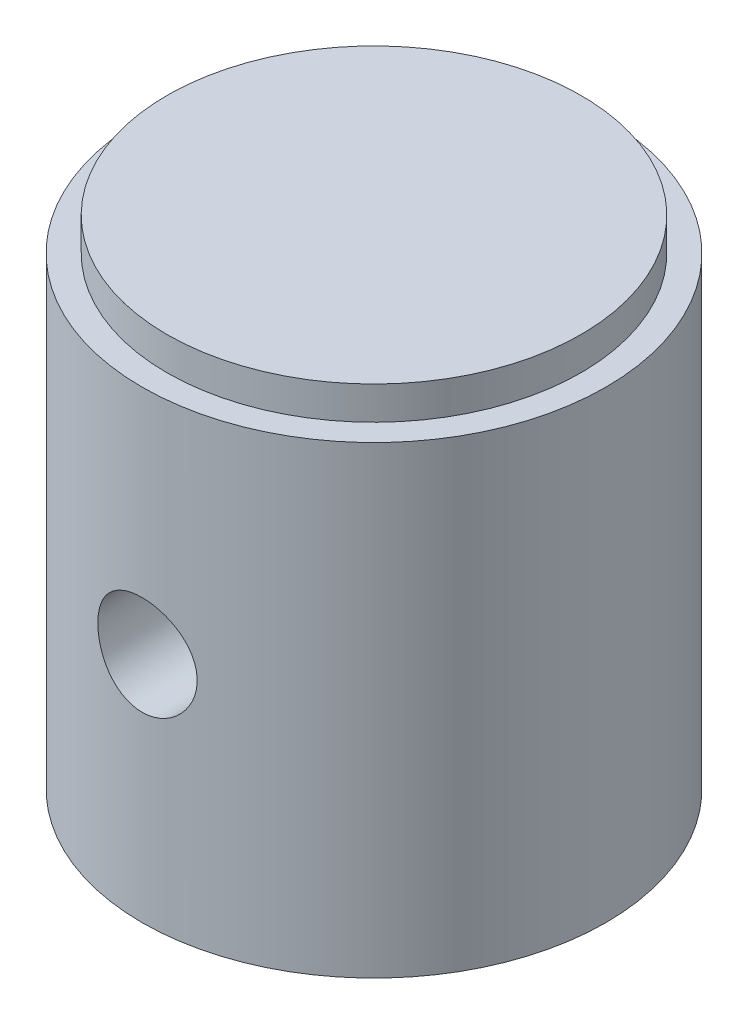
ISO-10303-21;
HEADER;
FILE_DESCRIPTION(('STEP AP214'),'2;1');
FILE_NAME('part.step','',(''),(''),'','','');
FILE_SCHEMA(('AUTOMOTIVE_DESIGN { 1 0 10303 214 1 1 1 1 }'));
ENDSEC;
DATA;
#1=APPLICATION_CONTEXT('core data for automotive mechanical design processes');
#2=APPLICATION_PROTOCOL_DEFINITION('international standard','automotive_design',2000,#1);
#3=PRODUCT_CONTEXT('',#1,'mechanical');
#4=PRODUCT('Part','Part','',(#3));
#5=PRODUCT_RELATED_PRODUCT_CATEGORY('part','',(#4));
#6=PRODUCT_DEFINITION_FORMATION('','',#4);
#7=PRODUCT_DEFINITION_CONTEXT('part definition',#1,'design');
#8=PRODUCT_DEFINITION('design','',#6,#7);
#9=PRODUCT_DEFINITION_SHAPE('','',#8);
#10=(LENGTH_UNIT() NAMED_UNIT(*) SI_UNIT(.MILLI.,.METRE.));
#11=(NAMED_UNIT(*) PLANE_ANGLE_UNIT() SI_UNIT($,.RADIAN.));
#12=(NAMED_UNIT(*) SI_UNIT($,.STERADIAN.) SOLID_ANGLE_UNIT());
#13=UNCERTAINTY_MEASURE_WITH_UNIT(LENGTH_MEASURE(1.E-05),#10,'distance_accuracy_value','');
#14=(GEOMETRIC_REPRESENTATION_CONTEXT(3) GLOBAL_UNCERTAINTY_ASSIGNED_CONTEXT((#13)) GLOBAL_UNIT_ASSIGNED_CONTEXT((#10,
#11,#12)) REPRESENTATION_CONTEXT('',''));
#15=CARTESIAN_POINT('',(0.,0.,0.));
#16=DIRECTION('',(0.,0.,1.));
#17=DIRECTION('',(1.,0.,0.));
#18=AXIS2_PLACEMENT_3D('',#15,#16,#17);
#19=CARTESIAN_POINT('',(-7.,-7.,0.));
#20=DIRECTION('',(0.,-1.,0.));
#21=DIRECTION('',(0.,0.,-1.));
#22=AXIS2_PLACEMENT_3D('',#19,#20,#21);
#23=PLANE('',#22);
#24=CARTESIAN_POINT('',(0.,-7.,0.));
#25=DIRECTION('',(0.,1.,0.));
#26=DIRECTION('',(0.,0.,1.));
#27=AXIS2_PLACEMENT_3D('',#24,#25,#26);
#28=CIRCLE('',#27,6.2);
#29=CARTESIAN_POINT('',(0.,-7.,6.2));
#30=VERTEX_POINT('',#29);
#31=EDGE_CURVE('E71',#30,#30,#28,.T.);
#32=ORIENTED_EDGE('',*,*,#31,.T.);
#33=EDGE_LOOP('',(#32));
#34=FACE_BOUND('',#33,.T.);
#35=CARTESIAN_POINT('',(0.,-7.,0.));
#36=DIRECTION('',(0.,1.,0.));
#37=DIRECTION('',(0.,0.,1.));
#38=AXIS2_PLACEMENT_3D('',#35,#36,#37);
#39=CIRCLE('',#38,7.);
#40=CARTESIAN_POINT('',(0.,-7.,7.));
#41=VERTEX_POINT('',#40);
#42=EDGE_CURVE('E128',#41,#41,#39,.T.);
#43=ORIENTED_EDGE('',*,*,#42,.F.);
#44=EDGE_LOOP('',(#43));
#45=FACE_BOUND('',#44,.T.);
#46=ADVANCED_FACE('F39',(#34,#45),#23,.T.);
#47=CARTESIAN_POINT('',(0.,-7.,0.));
#48=DIRECTION('',(0.,-1.,0.));
#49=DIRECTION('',(0.,0.,-1.));
#50=AXIS2_PLACEMENT_3D('',#47,#48,#49);
#51=CONICAL_SURFACE('',#50,6.2,0.34906585039886);
#52=CARTESIAN_POINT('',(0.,-3.01615774179072,0.));
#53=DIRECTION('',(0.,1.,0.));
#54=DIRECTION('',(0.,0.,1.));
#55=AXIS2_PLACEMENT_3D('',#52,#53,#54);
#56=CIRCLE('',#55,4.75);
#57=CARTESIAN_POINT('',(0.,-3.01615774179072,4.75));
#58=VERTEX_POINT('',#57);
#59=EDGE_CURVE('E65',#58,#58,#56,.T.);
#60=ORIENTED_EDGE('',*,*,#59,.T.);
#61=EDGE_LOOP('',(#60));
#62=FACE_BOUND('',#61,.T.);
#63=ORIENTED_EDGE('',*,*,#31,.F.);
#64=EDGE_LOOP('',(#63));
#65=FACE_BOUND('',#64,.T.);
#66=ADVANCED_FACE('F112',(#62,#65),#51,.F.);
#67=CARTESIAN_POINT('',(0.,19.6875,0.));
#68=DIRECTION('',(0.,1.,0.));
#69=DIRECTION('',(0.,0.,1.));
#70=AXIS2_PLACEMENT_3D('',#67,#68,#69);
#71=CYLINDRICAL_SURFACE('',#70,4.75);
#72=CARTESIAN_POINT('',(0.,-1.5,4.75));
#73=CARTESIAN_POINT('',(-0.0820835447314043,-1.4999995960029,4.74999967904614));
#74=CARTESIAN_POINT('',(-0.164171496501827,-1.49324013050539,4.74785228936723));
#75=CARTESIAN_POINT('',(-0.325944116631497,-1.46645355077682,4.73949648091444));
#76=CARTESIAN_POINT('',(-0.405628283459122,-1.44642368752273,4.73328722070904));
#77=CARTESIAN_POINT('',(-0.560237269504345,-1.39384104381599,4.71748543187023));
#78=CARTESIAN_POINT('',(-0.635169334090951,-1.36130788889304,4.7078982073406));
#79=CARTESIAN_POINT('',(-0.778514579207215,-1.28472646357131,4.68632862599565));
#80=CARTESIAN_POINT('',(-0.846926688392995,-1.24067630516156,4.67434587655187));
#81=CARTESIAN_POINT('',(-0.977443078754499,-1.14085266257357,4.64883376662147));
#82=CARTESIAN_POINT('',(-1.03931346588882,-1.08478215126322,4.63527018347254));
#83=CARTESIAN_POINT('',(-1.15294742613926,-0.963141719877229,4.60832176901776));
#84=CARTESIAN_POINT('',(-1.2047090669501,-0.897569987790586,4.5949369723419));
#85=CARTESIAN_POINT('',(-1.29793466853577,-0.75675121788412,4.56949296853185));
#86=CARTESIAN_POINT('',(-1.33910462019172,-0.681301196555854,4.55747591989588));
#87=CARTESIAN_POINT('',(-1.40807389327236,-0.524107538223757,4.53664362085522));
#88=CARTESIAN_POINT('',(-1.43587682167781,-0.442365605954656,4.52782750686213));
#89=CARTESIAN_POINT('',(-1.47646364106285,-0.277551097630556,4.51475360613692));
#90=CARTESIAN_POINT('',(-1.48968210274354,-0.194596265591199,4.51036428133252));
#91=CARTESIAN_POINT('',(-1.50208257395981,-0.0275391017801456,4.50625061102434));
#92=CARTESIAN_POINT('',(-1.50126840605207,0.0565629112565528,4.50652499510325));
#93=CARTESIAN_POINT('',(-1.48596623804714,0.219915518838902,4.51159176137022));
#94=CARTESIAN_POINT('',(-1.47203288124122,0.299224716240832,4.5162008739663));
#95=CARTESIAN_POINT('',(-1.43178798005592,0.454316527442601,4.52911970742075));
#96=CARTESIAN_POINT('',(-1.40547509472982,0.530098758225031,4.53742982916608));
#97=CARTESIAN_POINT('',(-1.34083084084602,0.677297267875655,4.55695325959034));
#98=CARTESIAN_POINT('',(-1.30232683858134,0.748632023154816,4.56820783899944));
#99=CARTESIAN_POINT('',(-1.21451321691615,0.884008824349574,4.59233341866295));
#100=CARTESIAN_POINT('',(-1.16520074091948,0.94804893553449,4.60520484585311));
#101=CARTESIAN_POINT('',(-1.05445721763047,1.0701513614985,4.63184688202886));
#102=CARTESIAN_POINT('',(-0.992568961591256,1.12779672907412,4.64563145900086));
#103=CARTESIAN_POINT('',(-0.859832533931192,1.2319932402701,4.67201892608795));
#104=CARTESIAN_POINT('',(-0.78898367078958,1.27854352684441,4.68462172487032));
#105=CARTESIAN_POINT('',(-0.639521244304239,1.35951904447478,4.70736283385871));
#106=CARTESIAN_POINT('',(-0.56084940322956,1.3938429460244,4.71748034190942));
#107=CARTESIAN_POINT('',(-0.398454273025006,1.44864477780197,4.73396063106369));
#108=CARTESIAN_POINT('',(-0.314732560358458,1.46912700498973,4.74032457733139));
#109=CARTESIAN_POINT('',(-0.148151942001063,1.49494945913915,4.74839235389519));
#110=CARTESIAN_POINT('',(-0.0653887879529904,1.50085396580235,4.75026975398177));
#111=CARTESIAN_POINT('',(0.0999556894804203,1.49894688258364,4.74966735792892));
#112=CARTESIAN_POINT('',(0.182537038204382,1.49113734353798,4.74718821327919));
#113=CARTESIAN_POINT('',(0.342984606452105,1.46247591011593,4.73826543461407));
#114=CARTESIAN_POINT('',(0.420917353280695,1.44196140872058,4.73192442641254));
#115=CARTESIAN_POINT('',(0.572211571751272,1.38888562686362,4.71602217273612));
#116=CARTESIAN_POINT('',(0.645572474036247,1.35632284945278,4.70646052712338));
#117=CARTESIAN_POINT('',(0.787656381223485,1.2791769099363,4.68480447515659));
#118=CARTESIAN_POINT('',(0.85622009899537,1.23431674292693,4.67265334948307));
#119=CARTESIAN_POINT('',(0.98503489825459,1.13418067887393,4.64720609363859));
#120=CARTESIAN_POINT('',(1.04528367215737,1.07890190045923,4.63390964727141));
#121=CARTESIAN_POINT('',(1.15829337789972,0.956843403257348,4.60699149316922));
#122=CARTESIAN_POINT('',(1.21065200367447,0.889688439428548,4.593378435549));
#123=CARTESIAN_POINT('',(1.3033950666371,0.747249961456588,4.5679297313532));
#124=CARTESIAN_POINT('',(1.34377965554056,0.671966550320408,4.55609406225838));
#125=CARTESIAN_POINT('',(1.41118548758715,0.515538051119366,4.53566962908159));
#126=CARTESIAN_POINT('',(1.43825519702983,0.434415473075744,4.52706911631109));
#127=CARTESIAN_POINT('',(1.47824972090378,0.268435199877372,4.5141696846939));
#128=CARTESIAN_POINT('',(1.49118006577835,0.183578978611892,4.50986908404445));
#129=CARTESIAN_POINT('',(1.50212620605735,0.0167530740697954,4.50623416787646));
#130=CARTESIAN_POINT('',(1.50080314084641,-0.0651689599984478,4.50667969384457));
#131=CARTESIAN_POINT('',(1.48488083195079,-0.227561657886265,4.51195053556041));
#132=CARTESIAN_POINT('',(1.47028223238921,-0.308032391929095,4.51677563881295));
#133=CARTESIAN_POINT('',(1.42866989928935,-0.464028470782518,4.53010652438159));
#134=CARTESIAN_POINT('',(1.40184917312304,-0.539610572788347,4.53855497041869));
#135=CARTESIAN_POINT('',(1.33670650315647,-0.685261995788799,4.55816492249634));
#136=CARTESIAN_POINT('',(1.29838218467217,-0.755330174772464,4.56932698861838));
#137=CARTESIAN_POINT('',(1.2095354013046,-0.890986745297526,4.59366117792159));
#138=CARTESIAN_POINT('',(1.15858784628932,-0.956285508268395,4.60689565835744));
#139=CARTESIAN_POINT('',(1.0466842406539,-1.07762083763069,4.63360081206468));
#140=CARTESIAN_POINT('',(0.985725490335815,-1.13365489742713,4.64707154816902));
#141=CARTESIAN_POINT('',(0.853066326423951,-1.23675692430509,4.67327443028953));
#142=CARTESIAN_POINT('',(0.781073823515226,-1.28346039072967,4.68596655437371));
#143=CARTESIAN_POINT('',(0.629859472842861,-1.36404168437099,4.70867379243004));
#144=CARTESIAN_POINT('',(0.550640331972045,-1.39792428963458,4.71868990328235));
#145=CARTESIAN_POINT('',(0.393635914977816,-1.44959876910323,4.7342664308075));
#146=CARTESIAN_POINT('',(0.316225133186438,-1.46844387958559,4.74011460510933));
#147=CARTESIAN_POINT('',(0.159210635950566,-1.49364336266444,4.7479811380776));
#148=CARTESIAN_POINT('',(0.0796073905560849,-1.50000039181002,4.75000031127187));
#149=CARTESIAN_POINT('',(0.,-1.5,4.75));
#150=B_SPLINE_CURVE_WITH_KNOTS('',3,(#72,#73,#74,#75,#76,#77,#78,#79,#80,#81,#82,#83,#84,#85,
#86,#87,#88,#89,#90,#91,#92,#93,#94,#95,#96,#97,#98,#99,#100,#101,#102,#103,#104,#105,#106,#107,
#108,#109,#110,#111,#112,#113,#114,#115,#116,#117,#118,#119,#120,#121,#122,#123,#124,#125,#126,
#127,#128,#129,#130,#131,#132,#133,#134,#135,#136,#137,#138,#139,#140,#141,#142,#143,#144,#145,
#146,#147,#148,#149),.UNSPECIFIED.,.T.,.F.,(4,2,2,2,2,2,2,2,2,2,2,2,2,2,2,2,2,2,2,2,2,2,2,2,2,2,
2,2,2,2,2,2,2,2,2,2,2,2,4),(0.,0.24595797085269,0.491966908951221,0.737591271008996,
0.9832559241528,1.23588716608584,1.4885666517754,1.74764569043263,2.00665477945945,
2.25771831624514,2.50871346318116,2.74955211816805,2.99041686673246,3.23485763830865,
3.47936309176113,3.73524847406481,3.99115361598384,4.24913282924923,4.50703191953741,
4.75477968540459,5.00249040554177,5.24388939060298,5.48531837858215,5.73270991189647,
5.98016996447342,6.23765665880274,6.49514009053908,6.75167921313646,7.00811795759371,
7.25271509638718,7.49730036806766,7.73815036093371,7.97905010664366,8.22954585775128,
8.48010927077556,8.73909121554315,8.99797654827696,9.23656564494835,9.47510398183575),.UNSPECIFIED.);
#151=CARTESIAN_POINT('',(0.,-1.5,4.75));
#152=VERTEX_POINT('',#151);
#153=EDGE_CURVE('E105',#152,#152,#150,.T.);
#154=ORIENTED_EDGE('',*,*,#153,.F.);
#155=EDGE_LOOP('',(#154));
#156=FACE_BOUND('',#155,.T.);
#157=CARTESIAN_POINT('',(1.5,0.,-4.50693909432998));
#158=CARTESIAN_POINT('',(1.49999958004515,0.0819682826761411,-4.50693949515468));
#159=CARTESIAN_POINT('',(1.49325840231682,0.163940983724744,-4.50919970874085));
#160=CARTESIAN_POINT('',(1.46655104887094,0.325475009499449,-4.5179553253781));
#161=CARTESIAN_POINT('',(1.44658152131253,0.405035717722683,-4.52445180182027));
#162=CARTESIAN_POINT('',(1.39417508352591,0.559382202849531,-4.54087234787262));
#163=CARTESIAN_POINT('',(1.36176059537411,0.634176286811513,-4.55079024986066));
#164=CARTESIAN_POINT('',(1.28545946652237,0.77728605600465,-4.57292751994247));
#165=CARTESIAN_POINT('',(1.24157071835092,0.845600547987965,-4.58514731070763));
#166=CARTESIAN_POINT('',(1.14191784971278,0.976208671452058,-4.6109923380212));
#167=CARTESIAN_POINT('',(1.08582030493755,1.03824156373591,-4.62464992232587));
#168=CARTESIAN_POINT('',(0.964055421977067,1.15219435282351,-4.65155671093151));
#169=CARTESIAN_POINT('',(0.89838672023377,1.20411280620364,-4.66480585671777));
#170=CARTESIAN_POINT('',(0.757464836701734,1.29751850612538,-4.68977365915903));
#171=CARTESIAN_POINT('',(0.682025001056138,1.33873651170335,-4.70144979545653));
#172=CARTESIAN_POINT('',(0.524852067423557,1.40779725722458,-4.72157773016224));
#173=CARTESIAN_POINT('',(0.443120487221092,1.43564321130615,-4.73003030329318));
#174=CARTESIAN_POINT('',(0.278414775826808,1.47629673110112,-4.74252974850081));
#175=CARTESIAN_POINT('',(0.195560751143444,1.48955010145605,-4.74670693307633));
#176=CARTESIAN_POINT('',(0.028706728610297,1.50205550409757,-4.75064554540297));
#177=CARTESIAN_POINT('',(-0.0552929988694201,1.50131078451008,-4.75040799755163));
#178=CARTESIAN_POINT('',(-0.218913619351864,1.48613280044412,-4.74563427350171));
#179=CARTESIAN_POINT('',(-0.298584494979865,1.47218295028315,-4.74124990899214));
#180=CARTESIAN_POINT('',(-0.454390311754809,1.43178484234958,-4.72886249486103));
#181=CARTESIAN_POINT('',(-0.530525020335841,1.40533576380501,-4.72085920760149));
#182=CARTESIAN_POINT('',(-0.678203652675078,1.34038381811517,-4.7019310355991));
#183=CARTESIAN_POINT('',(-0.749679013295809,1.30173567232402,-4.69097118266662));
#184=CARTESIAN_POINT('',(-0.885279102378907,1.21359968541286,-4.66728249867119));
#185=CARTESIAN_POINT('',(-0.949401935733847,1.16410905917775,-4.65455321340063));
#186=CARTESIAN_POINT('',(-1.07135837440922,1.05321803376508,-4.62803989727125));
#187=CARTESIAN_POINT('',(-1.12880871974839,0.991400765947416,-4.61423403233704));
#188=CARTESIAN_POINT('',(-1.23264301054731,0.858881841020854,-4.58758892442481));
#189=CARTESIAN_POINT('',(-1.27902559442059,0.788179092427403,-4.57474980051078));
#190=CARTESIAN_POINT('',(-1.35986638692084,0.638793228168752,-4.55138024059369));
#191=CARTESIAN_POINT('',(-1.39417963639867,0.560026861383904,-4.54087839223384));
#192=CARTESIAN_POINT('',(-1.44893342452635,0.397421898284389,-4.5237069894911));
#193=CARTESIAN_POINT('',(-1.46937907304313,0.313585182683363,-4.5170360236621));
#194=CARTESIAN_POINT('',(-1.49507161979024,0.146897639676088,-4.5085959379324));
#195=CARTESIAN_POINT('',(-1.50090655288536,0.064146996321232,-4.50663729609298));
#196=CARTESIAN_POINT('',(-1.49886513965521,-0.101157715966481,-4.50731687465407));
#197=CARTESIAN_POINT('',(-1.49099096720734,-0.183711813987271,-4.50995436623754));
#198=CARTESIAN_POINT('',(-1.46228084598242,-0.343726687897469,-4.51934163323601));
#199=CARTESIAN_POINT('',(-1.4418371919129,-0.421265920666951,-4.5259668251803));
#200=CARTESIAN_POINT('',(-1.38903056686353,-0.57180393247881,-4.54245022183902));
#201=CARTESIAN_POINT('',(-1.35666562487664,-0.644801958366223,-4.55230896114271));
#202=CARTESIAN_POINT('',(-1.2798587413425,-0.78654170372151,-4.57450539166733));
#203=CARTESIAN_POINT('',(-1.2350921421442,-0.855097228273855,-4.58690698850856));
#204=CARTESIAN_POINT('',(-1.13512998682984,-0.98393704575857,-4.61266077618539));
#205=CARTESIAN_POINT('',(-1.07993166463934,-1.0442191375734,-4.62601321856053));
#206=CARTESIAN_POINT('',(-0.957886037531119,-1.15744177660799,-4.65285013455169));
#207=CARTESIAN_POINT('',(-0.890643665109767,-1.20996198288841,-4.66631614662306));
#208=CARTESIAN_POINT('',(-0.747973360630616,-1.30299130819133,-4.6912975579683));
#209=CARTESIAN_POINT('',(-0.672545793179843,-1.34350096192049,-4.70281304406929));
#210=CARTESIAN_POINT('',(-0.516099288450847,-1.41097236253163,-4.72253168708172));
#211=CARTESIAN_POINT('',(-0.435125281433142,-1.43803103178452,-4.73075845435932));
#212=CARTESIAN_POINT('',(-0.269469399491867,-1.478053044343,-4.7430763734001));
#213=CARTESIAN_POINT('',(-0.184788721002361,-1.49102090146525,-4.74716884950256));
#214=CARTESIAN_POINT('',(-0.017988648587824,-1.50212030326586,-4.7506674317259));
#215=CARTESIAN_POINT('',(0.0640868361538649,-1.50085840271502,-4.75026513795577));
#216=CARTESIAN_POINT('',(0.226803220963033,-1.48500545466395,-4.74528029002945));
#217=CARTESIAN_POINT('',(0.307444217580877,-1.47041530772828,-4.74069801830655));
#218=CARTESIAN_POINT('',(0.463969836764499,-1.42870894005712,-4.72793024704182));
#219=CARTESIAN_POINT('',(0.539902672774311,-1.4017580672524,-4.71979237633648));
#220=CARTESIAN_POINT('',(0.686204345183071,-1.33624514340539,-4.70075227796056));
#221=CARTESIAN_POINT('',(0.756572215112847,-1.29768108106414,-4.68984957149724));
#222=CARTESIAN_POINT('',(0.892382156713932,-1.20850268052653,-4.66594837362514));
#223=CARTESIAN_POINT('',(0.957571386267191,-1.15751932859434,-4.65289067194133));
#224=CARTESIAN_POINT('',(1.07867009763973,-1.04559678750154,-4.62631837968684));
#225=CARTESIAN_POINT('',(1.13457676425287,-0.984654589110596,-4.61280365200012));
#226=CARTESIAN_POINT('',(1.23744612372159,-0.852058557227864,-4.58630016066439));
#227=CARTESIAN_POINT('',(1.28403955823579,-0.780110701741931,-4.5733449634976));
#228=CARTESIAN_POINT('',(1.36442560849337,-0.629013943279334,-4.55001145096036));
#229=CARTESIAN_POINT('',(1.39822313048984,-0.549867814754984,-4.5396321484584));
#230=CARTESIAN_POINT('',(1.44974900503547,-0.39305354742876,-4.52342799882925));
#231=CARTESIAN_POINT('',(1.46853682069789,-0.315763554142098,-4.51730787458817));
#232=CARTESIAN_POINT('',(1.49366090326981,-0.158983374147427,-4.50906374742014));
#233=CARTESIAN_POINT('',(1.50000040727695,-0.0794937648882832,-4.50693870560567));
#234=CARTESIAN_POINT('',(1.5,0.,-4.50693909432998));
#235=B_SPLINE_CURVE_WITH_KNOTS('',3,(#157,#158,#159,#160,#161,#162,#163,#164,#165,#166,#167,
#168,#169,#170,#171,#172,#173,#174,#175,#176,#177,#178,#179,#180,#181,#182,#183,#184,#185,#186,
#187,#188,#189,#190,#191,#192,#193,#194,#195,#196,#197,#198,#199,#200,#201,#202,#203,#204,#205,
#206,#207,#208,#209,#210,#211,#212,#213,#214,#215,#216,#217,#218,#219,#220,#221,#222,#223,#224,
#225,#226,#227,#228,#229,#230,#231,#232,#233,#234),.UNSPECIFIED.,.T.,.F.,(4,2,2,2,2,2,2,2,2,2,2,
2,2,2,2,2,2,2,2,2,2,2,2,2,2,2,2,2,2,2,2,2,2,2,2,2,2,2,4),(0.,0.245611090579273,
0.491284438685784,0.736517218845768,0.981795072467575,1.23487733964253,1.48799569757339,
1.74697244897189,2.00588692090239,2.25665093580603,2.50735676398231,2.74922580012767,
2.99111072100683,3.2359924360223,3.48093712787276,3.7362950135404,3.99168429786021,
4.25004385973256,4.50830817072249,4.75599786818586,5.00364829262799,5.24393641423545,
5.48426428174336,5.73160040316639,5.97900220045884,6.23690747266809,6.49480126127746,
6.75080881416402,7.0067343340116,7.25179355317672,7.49683621537552,7.73869250201122,
7.9805907000726,8.2308132702795,8.48111158966217,8.739930558781,8.99865018989115,
9.23690856092584,9.47510496630383),.UNSPECIFIED.);
#236=CARTESIAN_POINT('',(1.5,0.,-4.50693909432998));
#237=VERTEX_POINT('',#236);
#238=EDGE_CURVE('E98',#237,#237,#235,.T.);
#239=ORIENTED_EDGE('',*,*,#238,.F.);
#240=EDGE_LOOP('',(#239));
#241=FACE_BOUND('',#240,.T.);
#242=CARTESIAN_POINT('',(0.,4.,0.));
#243=DIRECTION('',(0.,1.,0.));
#244=DIRECTION('',(0.,0.,1.));
#245=AXIS2_PLACEMENT_3D('',#242,#243,#244);
#246=CIRCLE('',#245,4.75);
#247=CARTESIAN_POINT('',(0.,4.,4.75));
#248=VERTEX_POINT('',#247);
#249=EDGE_CURVE('E62',#248,#248,#246,.T.);
#250=ORIENTED_EDGE('',*,*,#249,.T.);
#251=EDGE_LOOP('',(#250));
#252=FACE_BOUND('',#251,.T.);
#253=ORIENTED_EDGE('',*,*,#59,.F.);
#254=EDGE_LOOP('',(#253));
#255=FACE_BOUND('',#254,.T.);
#256=ADVANCED_FACE('F58',(#156,#241,#252,#255),#71,.F.);
#257=CARTESIAN_POINT('',(0.,4.,0.));
#258=DIRECTION('',(0.,-1.,0.));
#259=DIRECTION('',(0.,0.,-1.));
#260=AXIS2_PLACEMENT_3D('',#257,#258,#259);
#261=CONICAL_SURFACE('',#260,4.75,1.02974425867665);
#262=CARTESIAN_POINT('',(0.,6.85408794038094,0.));
#263=VERTEX_POINT('',#262);
#264=VERTEX_LOOP('',#263);
#265=FACE_BOUND('',#264,.T.);
#266=ORIENTED_EDGE('',*,*,#249,.F.);
#267=EDGE_LOOP('',(#266));
#268=FACE_BOUND('',#267,.T.);
#269=ADVANCED_FACE('F54',(#265,#268),#261,.F.);
#270=CARTESIAN_POINT('',(0.,8.,0.));
#271=DIRECTION('',(0.,1.,0.));
#272=DIRECTION('',(0.,0.,1.));
#273=AXIS2_PLACEMENT_3D('',#270,#271,#272);
#274=PLANE('',#273);
#275=CARTESIAN_POINT('',(0.,8.,0.));
#276=DIRECTION('',(0.,1.,0.));
#277=DIRECTION('',(0.,0.,1.));
#278=AXIS2_PLACEMENT_3D('',#275,#276,#277);
#279=CIRCLE('',#278,6.25);
#280=CARTESIAN_POINT('',(0.,8.,6.25));
#281=VERTEX_POINT('',#280);
#282=EDGE_CURVE('E66',#281,#281,#279,.T.);
#283=ORIENTED_EDGE('',*,*,#282,.T.);
#284=EDGE_LOOP('',(#283));
#285=FACE_BOUND('',#284,.T.);
#286=ADVANCED_FACE('F57',(#285),#274,.T.);
#287=CARTESIAN_POINT('',(0.,19.6875,0.));
#288=DIRECTION('',(0.,1.,0.));
#289=DIRECTION('',(0.,0.,1.));
#290=AXIS2_PLACEMENT_3D('',#287,#288,#289);
#291=CYLINDRICAL_SURFACE('',#290,6.25);
#292=CARTESIAN_POINT('',(0.,7.,0.));
#293=DIRECTION('',(0.,1.,0.));
#294=DIRECTION('',(0.,0.,1.));
#295=AXIS2_PLACEMENT_3D('',#292,#293,#294);
#296=CIRCLE('',#295,6.25);
#297=CARTESIAN_POINT('',(0.,7.,6.25));
#298=VERTEX_POINT('',#297);
#299=EDGE_CURVE('E74',#298,#298,#296,.T.);
#300=ORIENTED_EDGE('',*,*,#299,.T.);
#301=EDGE_LOOP('',(#300));
#302=FACE_BOUND('',#301,.T.);
#303=ORIENTED_EDGE('',*,*,#282,.F.);
#304=EDGE_LOOP('',(#303));
#305=FACE_BOUND('',#304,.T.);
#306=ADVANCED_FACE('F141',(#302,#305),#291,.T.);
#307=CARTESIAN_POINT('',(-6.25,7.,0.));
#308=DIRECTION('',(0.,1.,0.));
#309=DIRECTION('',(0.,0.,1.));
#310=AXIS2_PLACEMENT_3D('',#307,#308,#309);
#311=PLANE('',#310);
#312=CARTESIAN_POINT('',(0.,7.,0.));
#313=DIRECTION('',(0.,1.,0.));
#314=DIRECTION('',(0.,0.,1.));
#315=AXIS2_PLACEMENT_3D('',#312,#313,#314);
#316=CIRCLE('',#315,7.);
#317=CARTESIAN_POINT('',(0.,7.,7.));
#318=VERTEX_POINT('',#317);
#319=EDGE_CURVE('E131',#318,#318,#316,.T.);
#320=ORIENTED_EDGE('',*,*,#319,.T.);
#321=EDGE_LOOP('',(#320));
#322=FACE_BOUND('',#321,.T.);
#323=ORIENTED_EDGE('',*,*,#299,.F.);
#324=EDGE_LOOP('',(#323));
#325=FACE_BOUND('',#324,.T.);
#326=ADVANCED_FACE('F144',(#322,#325),#311,.T.);
#327=CARTESIAN_POINT('',(0.,19.6875,0.));
#328=DIRECTION('',(0.,1.,0.));
#329=DIRECTION('',(0.,0.,1.));
#330=AXIS2_PLACEMENT_3D('',#327,#328,#329);
#331=CYLINDRICAL_SURFACE('',#330,7.);
#332=CARTESIAN_POINT('',(0.,1.5,-7.));
#333=CARTESIAN_POINT('',(0.0832358860906166,1.4999971004257,-6.99999846043226));
#334=CARTESIAN_POINT('',(0.166507195600275,1.49304839161214,-6.9985002594971));
#335=CARTESIAN_POINT('',(0.330687344293327,1.46546434314641,-6.99266829827727));
#336=CARTESIAN_POINT('',(0.41159440357119,1.44481895580507,-6.98833245637099));
#337=CARTESIAN_POINT('',(0.568649323817737,1.39051563539196,-6.97730831788826));
#338=CARTESIAN_POINT('',(0.644801963446556,1.35687102061868,-6.97062242967171));
#339=CARTESIAN_POINT('',(0.790378177960787,1.27756591382874,-6.9556210681797));
#340=CARTESIAN_POINT('',(0.859801981747369,1.23190583075006,-6.9473056503666));
#341=CARTESIAN_POINT('',(0.991024790535229,1.12911970032649,-6.9298136924631));
#342=CARTESIAN_POINT('',(1.05270503419445,1.07184377810147,-6.92062683143259));
#343=CARTESIAN_POINT('',(1.16566042389435,0.947773684314803,-6.90250069814144));
#344=CARTESIAN_POINT('',(1.21693467150908,0.880978691748742,-6.8935614473163));
#345=CARTESIAN_POINT('',(1.30814204379809,0.738894247139567,-6.87684116047225));
#346=CARTESIAN_POINT('',(1.34794958335009,0.66352248224379,-6.8690733634436));
#347=CARTESIAN_POINT('',(1.41428823691148,0.506965546233162,-6.85572325558537));
#348=CARTESIAN_POINT('',(1.44082087001716,0.425781041507426,-6.85014069470711));
#349=CARTESIAN_POINT('',(1.47946574422454,0.261188913411926,-6.8418980892631));
#350=CARTESIAN_POINT('',(1.49178779748342,0.177832724336135,-6.83919556896486));
#351=CARTESIAN_POINT('',(1.50231395206577,0.0101957674930048,-6.83689139845105));
#352=CARTESIAN_POINT('',(1.50051971664629,-0.0740848901799472,-6.83728938291729));
#353=CARTESIAN_POINT('',(1.48303326340861,-0.239624687933793,-6.84110276603832));
#354=CARTESIAN_POINT('',(1.46758398649408,-0.320910889100154,-6.84446541682162));
#355=CARTESIAN_POINT('',(1.42361054298677,-0.479710240289342,-6.85374593375788));
#356=CARTESIAN_POINT('',(1.39508566936466,-0.557223186032321,-6.85966393808402));
#357=CARTESIAN_POINT('',(1.32554551075991,-0.706962872873339,-6.87344080755724));
#358=CARTESIAN_POINT('',(1.2844361097283,-0.779144512712552,-6.88131420983365));
#359=CARTESIAN_POINT('',(1.19096007283993,-0.915675164957958,-6.89810572501288));
#360=CARTESIAN_POINT('',(1.13859196103562,-0.980023148686202,-6.90702397481896));
#361=CARTESIAN_POINT('',(1.0227954275532,-1.1004593556734,-6.92512718393878));
#362=CARTESIAN_POINT('',(0.95916023396441,-1.15634870658474,-6.93431383972178));
#363=CARTESIAN_POINT('',(0.823317306269096,-1.25669373368966,-6.95175017497059));
#364=CARTESIAN_POINT('',(0.7511094287754,-1.30114921860039,-6.95999983875972));
#365=CARTESIAN_POINT('',(0.599933462049959,-1.37741067990693,-6.97465778534003));
#366=CARTESIAN_POINT('',(0.520952258863483,-1.40919141257798,-6.98106238643354));
#367=CARTESIAN_POINT('',(0.358603146685707,-1.45897564832109,-6.99128109245334));
#368=CARTESIAN_POINT('',(0.275235851133669,-1.47698107256332,-6.99509555860383));
#369=CARTESIAN_POINT('',(0.108187670836629,-1.49841621414342,-6.99965306347808));
#370=CARTESIAN_POINT('',(0.0245431772716144,-1.50211771288178,-7.00045336521065));
#371=CARTESIAN_POINT('',(-0.142168973650405,-1.49557542887484,-6.99905248935969));
#372=CARTESIAN_POINT('',(-0.225236668127255,-1.48533255203706,-6.99685150675698));
#373=CARTESIAN_POINT('',(-0.387542537982806,-1.4514177563383,-6.98973143045266));
#374=CARTESIAN_POINT('',(-0.466811712908477,-1.42788763052747,-6.98484105045459));
#375=CARTESIAN_POINT('',(-0.620278450473418,-1.36822305700518,-6.9728892442151));
#376=CARTESIAN_POINT('',(-0.69447559258774,-1.33208756568835,-6.96582763822237));
#377=CARTESIAN_POINT('',(-0.836821397964754,-1.24766645693967,-6.950175043904));
#378=CARTESIAN_POINT('',(-0.90487257511114,-1.19922020509027,-6.94156431354275));
#379=CARTESIAN_POINT('',(-1.0319769255236,-1.09176517511126,-6.92381033034847));
#380=CARTESIAN_POINT('',(-1.091028978692,-1.03275508411256,-6.91466701142097));
#381=CARTESIAN_POINT('',(-1.19952711057989,-0.904602629812864,-6.89668172706324));
#382=CARTESIAN_POINT('',(-1.24878537255156,-0.835299900777897,-6.88784792221285));
#383=CARTESIAN_POINT('',(-1.3349641538604,-0.689245403522007,-6.87166654559681));
#384=CARTESIAN_POINT('',(-1.37188519913706,-0.612493953022508,-6.86431891048055));
#385=CARTESIAN_POINT('',(-1.43209741248548,-0.454127701005397,-6.8520100980739));
#386=CARTESIAN_POINT('',(-1.45546398641275,-0.372542643569332,-6.84703574582967));
#387=CARTESIAN_POINT('',(-1.48812696085335,-0.206484416166364,-6.84001186708418));
#388=CARTESIAN_POINT('',(-1.49742550780258,-0.12201168879868,-6.83796189439705));
#389=CARTESIAN_POINT('',(-1.5015999992604,0.045532343175243,-6.83704618848155));
#390=CARTESIAN_POINT('',(-1.49677347258311,0.128596014980579,-6.83811476518543));
#391=CARTESIAN_POINT('',(-1.47349789406331,0.292697242132587,-6.8431676318483));
#392=CARTESIAN_POINT('',(-1.45504898957979,0.373734819386573,-6.84715189026714));
#393=CARTESIAN_POINT('',(-1.40519345940434,0.531258657869168,-6.85755581104157));
#394=CARTESIAN_POINT('',(-1.37382847170887,0.607758648664291,-6.86396764224703));
#395=CARTESIAN_POINT('',(-1.29906751595601,0.75445537250685,-6.87850764590649));
#396=CARTESIAN_POINT('',(-1.255670353015,0.824651478615044,-6.88663598880363));
#397=CARTESIAN_POINT('',(-1.15708290349304,0.958218193725366,-6.90389055593232));
#398=CARTESIAN_POINT('',(-1.10167987421237,1.02142969594698,-6.91303309938926));
#399=CARTESIAN_POINT('',(-0.98108655461962,1.13775626252046,-6.93117449799694));
#400=CARTESIAN_POINT('',(-0.915894009385596,1.19086899431221,-6.94017331951296));
#401=CARTESIAN_POINT('',(-0.776603147268717,1.28611595950556,-6.95714491048987));
#402=CARTESIAN_POINT('',(-0.702404846009641,1.32810660623098,-6.96510364570626));
#403=CARTESIAN_POINT('',(-0.547850160940598,1.39895452890618,-6.97895826104018));
#404=CARTESIAN_POINT('',(-0.46749910586388,1.42782302258504,-6.98485590212342));
#405=CARTESIAN_POINT('',(-0.322535217553203,1.46635218513115,-6.99284848461771));
#406=CARTESIAN_POINT('',(-0.258717205545978,1.47894643398003,-6.99551391888263));
#407=CARTESIAN_POINT('',(-0.129939960853846,1.49577130171167,-6.99909024154719));
#408=CARTESIAN_POINT('',(-0.0649807750887446,1.50000226364606,-7.00000120191314));
#409=CARTESIAN_POINT('',(0.,1.5,-7.));
#410=B_SPLINE_CURVE_WITH_KNOTS('',3,(#332,#333,#334,#335,#336,#337,#338,#339,#340,#341,#342,
#343,#344,#345,#346,#347,#348,#349,#350,#351,#352,#353,#354,#355,#356,#357,#358,#359,#360,#361,
#362,#363,#364,#365,#366,#367,#368,#369,#370,#371,#372,#373,#374,#375,#376,#377,#378,#379,#380,
#381,#382,#383,#384,#385,#386,#387,#388,#389,#390,#391,#392,#393,#394,#395,#396,#397,#398,#399,
#400,#401,#402,#403,#404,#405,#406,#407,#408,#409),.UNSPECIFIED.,.T.,.F.,(4,2,2,2,2,2,2,2,2,2,2,
2,2,2,2,2,2,2,2,2,2,2,2,2,2,2,2,2,2,2,2,2,2,2,2,2,2,2,4),(0.,0.249469836512082,
0.499122883219936,0.748520824425602,0.997910278645886,1.25074961881732,1.50361077918506,
1.7591442921451,2.0146485567749,2.26633008124666,2.51798195169165,2.76524475452928,
3.01252092904568,3.26169356165968,3.51089887920889,3.76527011050291,4.0196455970235,
4.27452521139806,4.52936927256343,4.77934665704185,5.02930780231429,5.27665060589267,
5.52401389198434,5.77478733867803,6.02559197304485,6.28082063283534,6.53603841075806,
6.78982240408475,7.04356767229185,7.29200680540294,7.5404432510827,7.78808499706785,
8.03575134451623,8.28822950154114,8.54076590397115,8.79641910357222,9.05185334010271,
9.24661799132294,9.44137465337336),.UNSPECIFIED.);
#411=CARTESIAN_POINT('',(0.,1.5,-7.));
#412=VERTEX_POINT('',#411);
#413=EDGE_CURVE('E11',#412,#412,#410,.T.);
#414=ORIENTED_EDGE('',*,*,#413,.F.);
#415=EDGE_LOOP('',(#414));
#416=FACE_BOUND('',#415,.T.);
#417=CARTESIAN_POINT('',(0.,-1.5,7.));
#418=CARTESIAN_POINT('',(0.0832358860906165,-1.4999971004257,6.99999846043226));
#419=CARTESIAN_POINT('',(0.166507195600274,-1.49304839161215,6.9985002594971));
#420=CARTESIAN_POINT('',(0.330687344293327,-1.46546434314641,6.99266829827727));
#421=CARTESIAN_POINT('',(0.41159440357119,-1.44481895580507,6.98833245637099));
#422=CARTESIAN_POINT('',(0.568649323817737,-1.39051563539196,6.97730831788826));
#423=CARTESIAN_POINT('',(0.644801963446556,-1.35687102061868,6.97062242967171));
#424=CARTESIAN_POINT('',(0.790378177960788,-1.27756591382874,6.9556210681797));
#425=CARTESIAN_POINT('',(0.85980198174737,-1.23190583075006,6.9473056503666));
#426=CARTESIAN_POINT('',(0.99102479053523,-1.12911970032649,6.9298136924631));
#427=CARTESIAN_POINT('',(1.05270503419445,-1.07184377810147,6.92062683143259));
#428=CARTESIAN_POINT('',(1.16566042389435,-0.947773684314803,6.90250069814144));
#429=CARTESIAN_POINT('',(1.21693467150908,-0.880978691748742,6.8935614473163));
#430=CARTESIAN_POINT('',(1.30814204379809,-0.738894247139566,6.87684116047225));
#431=CARTESIAN_POINT('',(1.34794958335009,-0.66352248224379,6.8690733634436));
#432=CARTESIAN_POINT('',(1.41428823691148,-0.506965546233162,6.85572325558537));
#433=CARTESIAN_POINT('',(1.44082087001716,-0.425781041507426,6.85014069470711));
#434=CARTESIAN_POINT('',(1.47946574422454,-0.261188913411925,6.8418980892631));
#435=CARTESIAN_POINT('',(1.49178779748342,-0.177832724336134,6.83919556896486));
#436=CARTESIAN_POINT('',(1.50231395206577,-0.0101957674930048,6.83689139845105));
#437=CARTESIAN_POINT('',(1.50051971664629,0.0740848901799472,6.83728938291729));
#438=CARTESIAN_POINT('',(1.48303326340861,0.239624687933793,6.84110276603832));
#439=CARTESIAN_POINT('',(1.46758398649408,0.320910889100153,6.84446541682162));
#440=CARTESIAN_POINT('',(1.42361054298677,0.479710240289342,6.85374593375788));
#441=CARTESIAN_POINT('',(1.39508566936466,0.557223186032321,6.85966393808402));
#442=CARTESIAN_POINT('',(1.32554551075991,0.706962872873338,6.87344080755724));
#443=CARTESIAN_POINT('',(1.2844361097283,0.779144512712551,6.88131420983365));
#444=CARTESIAN_POINT('',(1.19096007283993,0.915675164957957,6.89810572501288));
#445=CARTESIAN_POINT('',(1.13859196103562,0.980023148686202,6.90702397481896));
#446=CARTESIAN_POINT('',(1.0227954275532,1.1004593556734,6.92512718393878));
#447=CARTESIAN_POINT('',(0.95916023396441,1.15634870658474,6.93431383972177));
#448=CARTESIAN_POINT('',(0.823317306269096,1.25669373368966,6.95175017497059));
#449=CARTESIAN_POINT('',(0.7511094287754,1.30114921860039,6.95999983875972));
#450=CARTESIAN_POINT('',(0.599933462049959,1.37741067990693,6.97465778534003));
#451=CARTESIAN_POINT('',(0.520952258863483,1.40919141257798,6.98106238643354));
#452=CARTESIAN_POINT('',(0.358603146685707,1.45897564832109,6.99128109245333));
#453=CARTESIAN_POINT('',(0.275235851133669,1.47698107256332,6.99509555860383));
#454=CARTESIAN_POINT('',(0.10818767083663,1.49841621414342,6.99965306347808));
#455=CARTESIAN_POINT('',(0.0245431772716154,1.50211771288178,7.00045336521065));
#456=CARTESIAN_POINT('',(-0.142168973650404,1.49557542887484,6.99905248935969));
#457=CARTESIAN_POINT('',(-0.225236668127255,1.48533255203706,6.99685150675698));
#458=CARTESIAN_POINT('',(-0.387542537982805,1.4514177563383,6.98973143045266));
#459=CARTESIAN_POINT('',(-0.466811712908477,1.42788763052747,6.98484105045459));
#460=CARTESIAN_POINT('',(-0.620278450473418,1.36822305700518,6.9728892442151));
#461=CARTESIAN_POINT('',(-0.69447559258774,1.33208756568835,6.96582763822237));
#462=CARTESIAN_POINT('',(-0.836821397964754,1.24766645693967,6.950175043904));
#463=CARTESIAN_POINT('',(-0.90487257511114,1.19922020509027,6.94156431354275));
#464=CARTESIAN_POINT('',(-1.0319769255236,1.09176517511126,6.92381033034847));
#465=CARTESIAN_POINT('',(-1.091028978692,1.03275508411256,6.91466701142097));
#466=CARTESIAN_POINT('',(-1.19952711057989,0.904602629812864,6.89668172706324));
#467=CARTESIAN_POINT('',(-1.24878537255157,0.835299900777897,6.88784792221285));
#468=CARTESIAN_POINT('',(-1.3349641538604,0.689245403522007,6.87166654559681));
#469=CARTESIAN_POINT('',(-1.37188519913706,0.612493953022508,6.86431891048055));
#470=CARTESIAN_POINT('',(-1.43209741248548,0.454127701005397,6.8520100980739));
#471=CARTESIAN_POINT('',(-1.45546398641275,0.372542643569332,6.84703574582967));
#472=CARTESIAN_POINT('',(-1.48812696085335,0.206484416166364,6.84001186708418));
#473=CARTESIAN_POINT('',(-1.49742550780258,0.12201168879868,6.83796189439705));
#474=CARTESIAN_POINT('',(-1.5015999992604,-0.0455323431752431,6.83704618848155));
#475=CARTESIAN_POINT('',(-1.49677347258311,-0.128596014980579,6.83811476518543));
#476=CARTESIAN_POINT('',(-1.47349789406331,-0.292697242132587,6.8431676318483));
#477=CARTESIAN_POINT('',(-1.45504898957979,-0.373734819386573,6.84715189026714));
#478=CARTESIAN_POINT('',(-1.40519345940434,-0.531258657869168,6.85755581104157));
#479=CARTESIAN_POINT('',(-1.37382847170887,-0.607758648664291,6.86396764224703));
#480=CARTESIAN_POINT('',(-1.29906751595601,-0.75445537250685,6.87850764590649));
#481=CARTESIAN_POINT('',(-1.255670353015,-0.824651478615044,6.88663598880362));
#482=CARTESIAN_POINT('',(-1.15708290349304,-0.958218193725365,6.90389055593232));
#483=CARTESIAN_POINT('',(-1.10167987421237,-1.02142969594698,6.91303309938926));
#484=CARTESIAN_POINT('',(-0.981086554619621,-1.13775626252046,6.93117449799694));
#485=CARTESIAN_POINT('',(-0.915894009385597,-1.1908689943122,6.94017331951296));
#486=CARTESIAN_POINT('',(-0.776603147268718,-1.28611595950556,6.95714491048987));
#487=CARTESIAN_POINT('',(-0.702404846009642,-1.32810660623098,6.96510364570626));
#488=CARTESIAN_POINT('',(-0.547850160940599,-1.39895452890618,6.97895826104018));
#489=CARTESIAN_POINT('',(-0.467499105863881,-1.42782302258504,6.98485590212342));
#490=CARTESIAN_POINT('',(-0.322535217553204,-1.46635218513115,6.99284848461771));
#491=CARTESIAN_POINT('',(-0.258717205545979,-1.47894643398003,6.99551391888263));
#492=CARTESIAN_POINT('',(-0.129939960853846,-1.49577130171167,6.99909024154719));
#493=CARTESIAN_POINT('',(-0.064980775088745,-1.50000226364606,7.00000120191314));
#494=CARTESIAN_POINT('',(0.,-1.5,7.));
#495=B_SPLINE_CURVE_WITH_KNOTS('',3,(#417,#418,#419,#420,#421,#422,#423,#424,#425,#426,#427,
#428,#429,#430,#431,#432,#433,#434,#435,#436,#437,#438,#439,#440,#441,#442,#443,#444,#445,#446,
#447,#448,#449,#450,#451,#452,#453,#454,#455,#456,#457,#458,#459,#460,#461,#462,#463,#464,#465,
#466,#467,#468,#469,#470,#471,#472,#473,#474,#475,#476,#477,#478,#479,#480,#481,#482,#483,#484,
#485,#486,#487,#488,#489,#490,#491,#492,#493,#494),.UNSPECIFIED.,.T.,.F.,(4,2,2,2,2,2,2,2,2,2,2,
2,2,2,2,2,2,2,2,2,2,2,2,2,2,2,2,2,2,2,2,2,2,2,2,2,2,2,4),(0.,0.249469836512082,
0.499122883219936,0.748520824425603,0.997910278645887,1.25074961881732,1.50361077918506,
1.7591442921451,2.0146485567749,2.26633008124666,2.51798195169165,2.76524475452928,
3.01252092904568,3.26169356165968,3.51089887920889,3.76527011050291,4.0196455970235,
4.27452521139806,4.52936927256343,4.77934665704185,5.02930780231429,5.27665060589267,
5.52401389198434,5.77478733867803,6.02559197304485,6.28082063283534,6.53603841075806,
6.78982240408475,7.04356767229185,7.29200680540294,7.5404432510827,7.78808499706785,
8.03575134451623,8.28822950154114,8.54076590397115,8.79641910357222,9.05185334010271,
9.24661799132294,9.44137465337336),.UNSPECIFIED.);
#496=CARTESIAN_POINT('',(0.,-1.5,7.));
#497=VERTEX_POINT('',#496);
#498=EDGE_CURVE('E51',#497,#497,#495,.T.);
#499=ORIENTED_EDGE('',*,*,#498,.F.);
#500=EDGE_LOOP('',(#499));
#501=FACE_BOUND('',#500,.T.);
#502=ORIENTED_EDGE('',*,*,#42,.T.);
#503=EDGE_LOOP('',(#502));
#504=FACE_BOUND('',#503,.T.);
#505=ORIENTED_EDGE('',*,*,#319,.F.);
#506=EDGE_LOOP('',(#505));
#507=FACE_BOUND('',#506,.T.);
#508=ADVANCED_FACE('F85',(#416,#501,#504,#507),#331,.T.);
#509=CARTESIAN_POINT('',(0.,0.,-7.));
#510=DIRECTION('',(0.,0.,1.));
#511=DIRECTION('',(1.,0.,0.));
#512=AXIS2_PLACEMENT_3D('',#509,#510,#511);
#513=CYLINDRICAL_SURFACE('',#512,1.5);
#514=ORIENTED_EDGE('',*,*,#238,.T.);
#515=EDGE_LOOP('',(#514));
#516=FACE_BOUND('',#515,.T.);
#517=ORIENTED_EDGE('',*,*,#413,.T.);
#518=EDGE_LOOP('',(#517));
#519=FACE_BOUND('',#518,.T.);
#520=ADVANCED_FACE('F88',(#516,#519),#513,.F.);
#521=ORIENTED_EDGE('',*,*,#153,.T.);
#522=EDGE_LOOP('',(#521));
#523=FACE_BOUND('',#522,.T.);
#524=ORIENTED_EDGE('',*,*,#498,.T.);
#525=EDGE_LOOP('',(#524));
#526=FACE_BOUND('',#525,.T.);
#527=ADVANCED_FACE('F91',(#523,#526),#513,.F.);
#528=CLOSED_SHELL('',(#46,#66,#256,#269,#286,#306,#326,#508,#520,#527));
#529=MANIFOLD_SOLID_BREP('B2',#528);
#530=ADVANCED_BREP_SHAPE_REPRESENTATION('',(#18,#529),#14);
#531=SHAPE_DEFINITION_REPRESENTATION(#9,#530);
ENDSEC;
END-ISO-10303-21;
